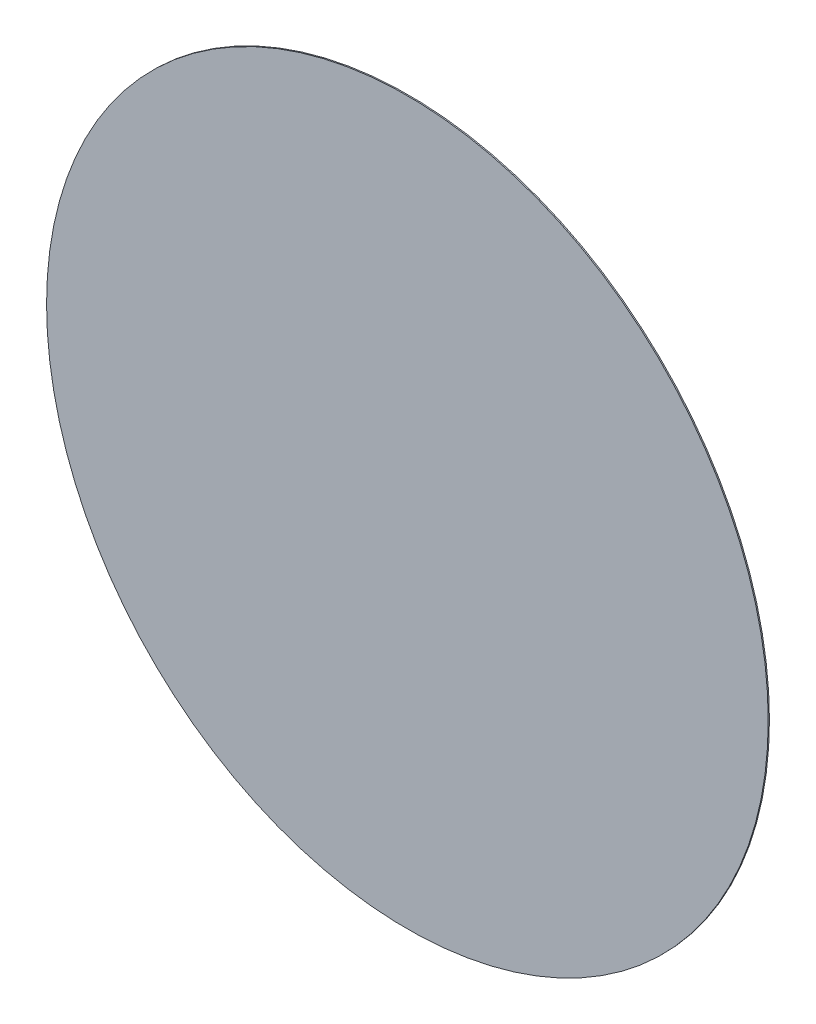
ISO-10303-21;
HEADER;
FILE_DESCRIPTION(('STEP AP214'),'2;1');
FILE_NAME('part.step','',(''),(''),'','','');
FILE_SCHEMA(('AUTOMOTIVE_DESIGN { 1 0 10303 214 1 1 1 1 }'));
ENDSEC;
DATA;
#1=APPLICATION_CONTEXT('core data for automotive mechanical design processes');
#2=APPLICATION_PROTOCOL_DEFINITION('international standard','automotive_design',2000,#1);
#3=PRODUCT_CONTEXT('',#1,'mechanical');
#4=PRODUCT('Part','Part','',(#3));
#5=PRODUCT_RELATED_PRODUCT_CATEGORY('part','',(#4));
#6=PRODUCT_DEFINITION_FORMATION('','',#4);
#7=PRODUCT_DEFINITION_CONTEXT('part definition',#1,'design');
#8=PRODUCT_DEFINITION('design','',#6,#7);
#9=PRODUCT_DEFINITION_SHAPE('','',#8);
#10=(LENGTH_UNIT() NAMED_UNIT(*) SI_UNIT(.MILLI.,.METRE.));
#11=(NAMED_UNIT(*) PLANE_ANGLE_UNIT() SI_UNIT($,.RADIAN.));
#12=(NAMED_UNIT(*) SI_UNIT($,.STERADIAN.) SOLID_ANGLE_UNIT());
#13=UNCERTAINTY_MEASURE_WITH_UNIT(LENGTH_MEASURE(1.E-05),#10,'distance_accuracy_value','');
#14=(GEOMETRIC_REPRESENTATION_CONTEXT(3) GLOBAL_UNCERTAINTY_ASSIGNED_CONTEXT((#13)) GLOBAL_UNIT_ASSIGNED_CONTEXT((#10,
#11,#12)) REPRESENTATION_CONTEXT('',''));
#15=CARTESIAN_POINT('',(0.,0.,0.));
#16=DIRECTION('',(0.,0.,1.));
#17=DIRECTION('',(1.,0.,0.));
#18=AXIS2_PLACEMENT_3D('',#15,#16,#17);
#19=CARTESIAN_POINT('',(0.,0.,0.05));
#20=DIRECTION('',(0.,0.,-1.));
#21=DIRECTION('',(-1.,0.,0.));
#22=AXIS2_PLACEMENT_3D('',#19,#20,#21);
#23=CYLINDRICAL_SURFACE('',#22,15.);
#24=CARTESIAN_POINT('',(0.,0.,0.05));
#25=DIRECTION('',(0.,0.,1.));
#26=DIRECTION('',(1.,0.,0.));
#27=AXIS2_PLACEMENT_3D('',#24,#25,#26);
#28=CIRCLE('',#27,15.);
#29=CARTESIAN_POINT('',(15.,0.,0.05));
#30=VERTEX_POINT('',#29);
#31=EDGE_CURVE('E10',#30,#30,#28,.T.);
#32=ORIENTED_EDGE('',*,*,#31,.F.);
#33=EDGE_LOOP('',(#32));
#34=FACE_BOUND('',#33,.T.);
#35=CARTESIAN_POINT('',(0.,0.,0.));
#36=DIRECTION('',(0.,0.,1.));
#37=DIRECTION('',(1.,0.,0.));
#38=AXIS2_PLACEMENT_3D('',#35,#36,#37);
#39=CIRCLE('',#38,15.);
#40=CARTESIAN_POINT('',(15.,0.,0.));
#41=VERTEX_POINT('',#40);
#42=EDGE_CURVE('E42',#41,#41,#39,.T.);
#43=ORIENTED_EDGE('',*,*,#42,.T.);
#44=EDGE_LOOP('',(#43));
#45=FACE_BOUND('',#44,.T.);
#46=ADVANCED_FACE('F39',(#34,#45),#23,.T.);
#47=CARTESIAN_POINT('',(0.,0.,0.05));
#48=DIRECTION('',(0.,0.,1.));
#49=DIRECTION('',(1.,0.,0.));
#50=AXIS2_PLACEMENT_3D('',#47,#48,#49);
#51=PLANE('',#50);
#52=ORIENTED_EDGE('',*,*,#31,.T.);
#53=EDGE_LOOP('',(#52));
#54=FACE_BOUND('',#53,.T.);
#55=ADVANCED_FACE('F54',(#54),#51,.T.);
#56=CARTESIAN_POINT('',(0.,0.,0.));
#57=DIRECTION('',(0.,0.,1.));
#58=DIRECTION('',(1.,0.,0.));
#59=AXIS2_PLACEMENT_3D('',#56,#57,#58);
#60=PLANE('',#59);
#61=ORIENTED_EDGE('',*,*,#42,.F.);
#62=EDGE_LOOP('',(#61));
#63=FACE_BOUND('',#62,.T.);
#64=ADVANCED_FACE('F52',(#63),#60,.F.);
#65=CLOSED_SHELL('',(#46,#55,#64));
#66=MANIFOLD_SOLID_BREP('B2',#65);
#67=ADVANCED_BREP_SHAPE_REPRESENTATION('',(#18,#66),#14);
#68=SHAPE_DEFINITION_REPRESENTATION(#9,#67);
ENDSEC;
END-ISO-10303-21;
